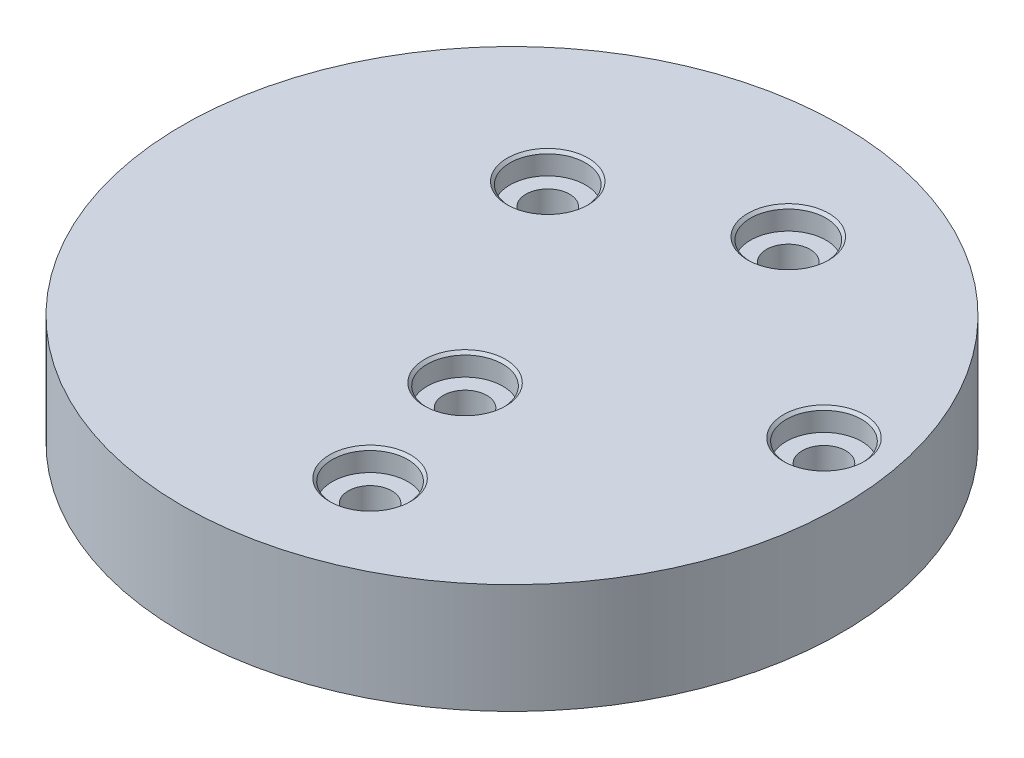
ISO-10303-21;
HEADER;
FILE_DESCRIPTION(('STEP AP214'),'2;1');
FILE_NAME('part.step','',(''),(''),'','','');
FILE_SCHEMA(('AUTOMOTIVE_DESIGN { 1 0 10303 214 1 1 1 1 }'));
ENDSEC;
DATA;
#1=APPLICATION_CONTEXT('core data for automotive mechanical design processes');
#2=APPLICATION_PROTOCOL_DEFINITION('international standard','automotive_design',2000,#1);
#3=PRODUCT_CONTEXT('',#1,'mechanical');
#4=PRODUCT('Part','Part','',(#3));
#5=PRODUCT_RELATED_PRODUCT_CATEGORY('part','',(#4));
#6=PRODUCT_DEFINITION_FORMATION('','',#4);
#7=PRODUCT_DEFINITION_CONTEXT('part definition',#1,'design');
#8=PRODUCT_DEFINITION('design','',#6,#7);
#9=PRODUCT_DEFINITION_SHAPE('','',#8);
#10=(LENGTH_UNIT() NAMED_UNIT(*) SI_UNIT(.MILLI.,.METRE.));
#11=(NAMED_UNIT(*) PLANE_ANGLE_UNIT() SI_UNIT($,.RADIAN.));
#12=(NAMED_UNIT(*) SI_UNIT($,.STERADIAN.) SOLID_ANGLE_UNIT());
#13=UNCERTAINTY_MEASURE_WITH_UNIT(LENGTH_MEASURE(1.E-05),#10,'distance_accuracy_value','');
#14=(GEOMETRIC_REPRESENTATION_CONTEXT(3) GLOBAL_UNCERTAINTY_ASSIGNED_CONTEXT((#13)) GLOBAL_UNIT_ASSIGNED_CONTEXT((#10,
#11,#12)) REPRESENTATION_CONTEXT('',''));
#15=CARTESIAN_POINT('',(0.,0.,0.));
#16=DIRECTION('',(0.,0.,1.));
#17=DIRECTION('',(1.,0.,0.));
#18=AXIS2_PLACEMENT_3D('',#15,#16,#17);
#19=CARTESIAN_POINT('',(0.,-25.4,0.));
#20=DIRECTION('',(0.,1.,0.));
#21=DIRECTION('',(0.,0.,1.));
#22=AXIS2_PLACEMENT_3D('',#19,#20,#21);
#23=CYLINDRICAL_SURFACE('',#22,76.2);
#24=CARTESIAN_POINT('',(0.,-25.4,0.));
#25=DIRECTION('',(0.,1.,0.));
#26=DIRECTION('',(0.,0.,1.));
#27=AXIS2_PLACEMENT_3D('',#24,#25,#26);
#28=CIRCLE('',#27,76.2);
#29=CARTESIAN_POINT('',(0.,-25.4,76.2));
#30=VERTEX_POINT('',#29);
#31=EDGE_CURVE('E10',#30,#30,#28,.T.);
#32=ORIENTED_EDGE('',*,*,#31,.T.);
#33=EDGE_LOOP('',(#32));
#34=FACE_BOUND('',#33,.T.);
#35=CARTESIAN_POINT('',(0.,0.,0.));
#36=DIRECTION('',(0.,1.,0.));
#37=DIRECTION('',(0.,0.,1.));
#38=AXIS2_PLACEMENT_3D('',#35,#36,#37);
#39=CIRCLE('',#38,76.2);
#40=CARTESIAN_POINT('',(0.,0.,76.2));
#41=VERTEX_POINT('',#40);
#42=EDGE_CURVE('E34',#41,#41,#39,.T.);
#43=ORIENTED_EDGE('',*,*,#42,.F.);
#44=EDGE_LOOP('',(#43));
#45=FACE_BOUND('',#44,.T.);
#46=ADVANCED_FACE('F31',(#34,#45),#23,.T.);
#47=CARTESIAN_POINT('',(0.,-25.4,0.));
#48=DIRECTION('',(0.,1.,0.));
#49=DIRECTION('',(0.,0.,1.));
#50=AXIS2_PLACEMENT_3D('',#47,#48,#49);
#51=PLANE('',#50);
#52=CARTESIAN_POINT('',(60.5813080296116,-25.4,-11.5528843035122));
#53=DIRECTION('',(0.,1.,0.));
#54=DIRECTION('',(0.,0.,1.));
#55=AXIS2_PLACEMENT_3D('',#52,#53,#54);
#56=CIRCLE('',#55,5.04189999999999);
#57=CARTESIAN_POINT('',(60.5813080296116,-25.4,-6.51098430351221));
#58=VERTEX_POINT('',#57);
#59=EDGE_CURVE('E102',#58,#58,#56,.T.);
#60=ORIENTED_EDGE('',*,*,#59,.T.);
#61=EDGE_LOOP('',(#60));
#62=FACE_BOUND('',#61,.T.);
#63=CARTESIAN_POINT('',(16.1466383832476,-25.4,48.9641113854304));
#64=DIRECTION('',(0.,1.,0.));
#65=DIRECTION('',(0.,0.,1.));
#66=AXIS2_PLACEMENT_3D('',#63,#64,#65);
#67=CIRCLE('',#66,5.04189999999999);
#68=CARTESIAN_POINT('',(16.1466383832476,-25.4,54.0060113854304));
#69=VERTEX_POINT('',#68);
#70=EDGE_CURVE('E87',#69,#69,#67,.T.);
#71=ORIENTED_EDGE('',*,*,#70,.T.);
#72=EDGE_LOOP('',(#71));
#73=FACE_BOUND('',#72,.T.);
#74=CARTESIAN_POINT('',(8.01491971634505,-25.4,18.8718726723209));
#75=DIRECTION('',(0.,1.,0.));
#76=DIRECTION('',(0.,0.,1.));
#77=AXIS2_PLACEMENT_3D('',#74,#75,#76);
#78=CIRCLE('',#77,5.04189999999999);
#79=CARTESIAN_POINT('',(8.01491971634505,-25.4,23.9137726723209));
#80=VERTEX_POINT('',#79);
#81=EDGE_CURVE('E72',#80,#80,#78,.T.);
#82=ORIENTED_EDGE('',*,*,#81,.T.);
#83=EDGE_LOOP('',(#82));
#84=FACE_BOUND('',#83,.T.);
#85=CARTESIAN_POINT('',(-22.7228826413466,-25.4,-30.9884893052299));
#86=DIRECTION('',(0.,1.,0.));
#87=DIRECTION('',(0.,0.,1.));
#88=AXIS2_PLACEMENT_3D('',#85,#86,#87);
#89=CIRCLE('',#88,5.04189999999999);
#90=CARTESIAN_POINT('',(-22.7228826413466,-25.4,-25.9465893052299));
#91=VERTEX_POINT('',#90);
#92=EDGE_CURVE('E57',#91,#91,#89,.T.);
#93=ORIENTED_EDGE('',*,*,#92,.T.);
#94=EDGE_LOOP('',(#93));
#95=FACE_BOUND('',#94,.T.);
#96=CARTESIAN_POINT('',(16.1466383832476,-25.4,-47.7341404091476));
#97=DIRECTION('',(0.,1.,0.));
#98=DIRECTION('',(0.,0.,1.));
#99=AXIS2_PLACEMENT_3D('',#96,#97,#98);
#100=CIRCLE('',#99,5.04189999999999);
#101=CARTESIAN_POINT('',(16.1466383832476,-25.4,-42.6922404091476));
#102=VERTEX_POINT('',#101);
#103=EDGE_CURVE('E41',#102,#102,#100,.T.);
#104=ORIENTED_EDGE('',*,*,#103,.T.);
#105=EDGE_LOOP('',(#104));
#106=FACE_BOUND('',#105,.T.);
#107=ORIENTED_EDGE('',*,*,#31,.F.);
#108=EDGE_LOOP('',(#107));
#109=FACE_BOUND('',#108,.T.);
#110=ADVANCED_FACE('F124',(#62,#73,#84,#95,#106,#109),#51,.F.);
#111=CARTESIAN_POINT('',(0.,0.,0.));
#112=DIRECTION('',(0.,1.,0.));
#113=DIRECTION('',(0.,0.,1.));
#114=AXIS2_PLACEMENT_3D('',#111,#112,#113);
#115=PLANE('',#114);
#116=CARTESIAN_POINT('',(60.5813080296116,0.,-11.5528843035122));
#117=DIRECTION('',(0.,1.,0.));
#118=DIRECTION('',(0.,0.,1.));
#119=AXIS2_PLACEMENT_3D('',#116,#117,#118);
#120=CIRCLE('',#119,9.36624999999999);
#121=CARTESIAN_POINT('',(60.5813080296116,0.,-2.18663430351221));
#122=VERTEX_POINT('',#121);
#123=EDGE_CURVE('E114',#122,#122,#120,.T.);
#124=ORIENTED_EDGE('',*,*,#123,.F.);
#125=EDGE_LOOP('',(#124));
#126=FACE_BOUND('',#125,.T.);
#127=CARTESIAN_POINT('',(16.1466383832476,0.,48.9641113854304));
#128=DIRECTION('',(0.,1.,0.));
#129=DIRECTION('',(0.,0.,1.));
#130=AXIS2_PLACEMENT_3D('',#127,#128,#129);
#131=CIRCLE('',#130,9.36625);
#132=CARTESIAN_POINT('',(16.1466383832476,0.,58.3303613854304));
#133=VERTEX_POINT('',#132);
#134=EDGE_CURVE('E99',#133,#133,#131,.T.);
#135=ORIENTED_EDGE('',*,*,#134,.F.);
#136=EDGE_LOOP('',(#135));
#137=FACE_BOUND('',#136,.T.);
#138=CARTESIAN_POINT('',(8.01491971634505,0.,18.8718726723209));
#139=DIRECTION('',(0.,1.,0.));
#140=DIRECTION('',(0.,0.,1.));
#141=AXIS2_PLACEMENT_3D('',#138,#139,#140);
#142=CIRCLE('',#141,9.36625);
#143=CARTESIAN_POINT('',(8.01491971634505,0.,28.2381226723209));
#144=VERTEX_POINT('',#143);
#145=EDGE_CURVE('E84',#144,#144,#142,.T.);
#146=ORIENTED_EDGE('',*,*,#145,.F.);
#147=EDGE_LOOP('',(#146));
#148=FACE_BOUND('',#147,.T.);
#149=CARTESIAN_POINT('',(-22.7228826413466,0.,-30.9884893052299));
#150=DIRECTION('',(0.,1.,0.));
#151=DIRECTION('',(0.,0.,1.));
#152=AXIS2_PLACEMENT_3D('',#149,#150,#151);
#153=CIRCLE('',#152,9.36625);
#154=CARTESIAN_POINT('',(-22.7228826413466,0.,-21.6222393052299));
#155=VERTEX_POINT('',#154);
#156=EDGE_CURVE('E69',#155,#155,#153,.T.);
#157=ORIENTED_EDGE('',*,*,#156,.F.);
#158=EDGE_LOOP('',(#157));
#159=FACE_BOUND('',#158,.T.);
#160=CARTESIAN_POINT('',(16.1466383832476,0.,-47.7341404091476));
#161=DIRECTION('',(0.,1.,0.));
#162=DIRECTION('',(0.,0.,1.));
#163=AXIS2_PLACEMENT_3D('',#160,#161,#162);
#164=CIRCLE('',#163,9.36625);
#165=CARTESIAN_POINT('',(16.1466383832476,0.,-38.3678904091476));
#166=VERTEX_POINT('',#165);
#167=EDGE_CURVE('E54',#166,#166,#164,.T.);
#168=ORIENTED_EDGE('',*,*,#167,.F.);
#169=EDGE_LOOP('',(#168));
#170=FACE_BOUND('',#169,.T.);
#171=ORIENTED_EDGE('',*,*,#42,.T.);
#172=EDGE_LOOP('',(#171));
#173=FACE_BOUND('',#172,.T.);
#174=ADVANCED_FACE('F120',(#126,#137,#148,#159,#170,#173),#115,.T.);
#175=CARTESIAN_POINT('',(16.1466383832476,0.,-47.7341404091476));
#176=DIRECTION('',(0.,1.,0.));
#177=DIRECTION('',(0.,0.,1.));
#178=AXIS2_PLACEMENT_3D('',#175,#176,#177);
#179=CYLINDRICAL_SURFACE('',#178,5.0419);
#180=ORIENTED_EDGE('',*,*,#103,.F.);
#181=EDGE_LOOP('',(#180));
#182=FACE_BOUND('',#181,.T.);
#183=CARTESIAN_POINT('',(16.1466383832476,-5.0546,-47.7341404091476));
#184=DIRECTION('',(0.,1.,0.));
#185=DIRECTION('',(0.,0.,1.));
#186=AXIS2_PLACEMENT_3D('',#183,#184,#185);
#187=CIRCLE('',#186,5.0419);
#188=CARTESIAN_POINT('',(16.1466383832476,-5.0546,-42.6922404091476));
#189=VERTEX_POINT('',#188);
#190=EDGE_CURVE('E45',#189,#189,#187,.T.);
#191=ORIENTED_EDGE('',*,*,#190,.T.);
#192=EDGE_LOOP('',(#191));
#193=FACE_BOUND('',#192,.T.);
#194=ADVANCED_FACE('F123',(#182,#193),#179,.F.);
#195=CARTESIAN_POINT('',(24.8778883832476,-5.0546,-47.7341404091476));
#196=DIRECTION('',(0.,-1.,0.));
#197=DIRECTION('',(0.,0.,-1.));
#198=AXIS2_PLACEMENT_3D('',#195,#196,#197);
#199=PLANE('',#198);
#200=ORIENTED_EDGE('',*,*,#190,.F.);
#201=EDGE_LOOP('',(#200));
#202=FACE_BOUND('',#201,.T.);
#203=CARTESIAN_POINT('',(16.1466383832476,-5.0546,-47.7341404091476));
#204=DIRECTION('',(0.,1.,0.));
#205=DIRECTION('',(0.,0.,1.));
#206=AXIS2_PLACEMENT_3D('',#203,#204,#205);
#207=CIRCLE('',#206,8.73125);
#208=CARTESIAN_POINT('',(16.1466383832476,-5.0546,-39.0028904091476));
#209=VERTEX_POINT('',#208);
#210=EDGE_CURVE('E48',#209,#209,#207,.T.);
#211=ORIENTED_EDGE('',*,*,#210,.T.);
#212=EDGE_LOOP('',(#211));
#213=FACE_BOUND('',#212,.T.);
#214=ADVANCED_FACE('F147',(#202,#213),#199,.F.);
#215=CARTESIAN_POINT('',(16.1466383832476,0.,-47.7341404091476));
#216=DIRECTION('',(0.,1.,0.));
#217=DIRECTION('',(0.,0.,1.));
#218=AXIS2_PLACEMENT_3D('',#215,#216,#217);
#219=CYLINDRICAL_SURFACE('',#218,8.73125);
#220=ORIENTED_EDGE('',*,*,#210,.F.);
#221=EDGE_LOOP('',(#220));
#222=FACE_BOUND('',#221,.T.);
#223=CARTESIAN_POINT('',(16.1466383832476,-0.635,-47.7341404091476));
#224=DIRECTION('',(0.,1.,0.));
#225=DIRECTION('',(0.,0.,1.));
#226=AXIS2_PLACEMENT_3D('',#223,#224,#225);
#227=CIRCLE('',#226,8.73125);
#228=CARTESIAN_POINT('',(16.1466383832476,-0.635,-39.0028904091476));
#229=VERTEX_POINT('',#228);
#230=EDGE_CURVE('E51',#229,#229,#227,.T.);
#231=ORIENTED_EDGE('',*,*,#230,.T.);
#232=EDGE_LOOP('',(#231));
#233=FACE_BOUND('',#232,.T.);
#234=ADVANCED_FACE('F151',(#222,#233),#219,.F.);
#235=CARTESIAN_POINT('',(16.1466383832476,0.,-47.7341404091476));
#236=DIRECTION('',(0.,1.,0.));
#237=DIRECTION('',(0.,0.,1.));
#238=AXIS2_PLACEMENT_3D('',#235,#236,#237);
#239=CONICAL_SURFACE('',#238,9.36625,0.785398163397451);
#240=ORIENTED_EDGE('',*,*,#230,.F.);
#241=EDGE_LOOP('',(#240));
#242=FACE_BOUND('',#241,.T.);
#243=ORIENTED_EDGE('',*,*,#167,.T.);
#244=EDGE_LOOP('',(#243));
#245=FACE_BOUND('',#244,.T.);
#246=ADVANCED_FACE('F155',(#242,#245),#239,.F.);
#247=CARTESIAN_POINT('',(-22.7228826413466,0.,-30.9884893052299));
#248=DIRECTION('',(0.,1.,0.));
#249=DIRECTION('',(0.,0.,1.));
#250=AXIS2_PLACEMENT_3D('',#247,#248,#249);
#251=CYLINDRICAL_SURFACE('',#250,5.0419);
#252=ORIENTED_EDGE('',*,*,#92,.F.);
#253=EDGE_LOOP('',(#252));
#254=FACE_BOUND('',#253,.T.);
#255=CARTESIAN_POINT('',(-22.7228826413466,-5.0546,-30.9884893052299));
#256=DIRECTION('',(0.,1.,0.));
#257=DIRECTION('',(0.,0.,1.));
#258=AXIS2_PLACEMENT_3D('',#255,#256,#257);
#259=CIRCLE('',#258,5.0419);
#260=CARTESIAN_POINT('',(-22.7228826413466,-5.0546,-25.9465893052299));
#261=VERTEX_POINT('',#260);
#262=EDGE_CURVE('E60',#261,#261,#259,.T.);
#263=ORIENTED_EDGE('',*,*,#262,.T.);
#264=EDGE_LOOP('',(#263));
#265=FACE_BOUND('',#264,.T.);
#266=ADVANCED_FACE('F159',(#254,#265),#251,.F.);
#267=CARTESIAN_POINT('',(-13.9916326413466,-5.0546,-30.9884893052299));
#268=DIRECTION('',(0.,-1.,0.));
#269=DIRECTION('',(0.,0.,-1.));
#270=AXIS2_PLACEMENT_3D('',#267,#268,#269);
#271=PLANE('',#270);
#272=ORIENTED_EDGE('',*,*,#262,.F.);
#273=EDGE_LOOP('',(#272));
#274=FACE_BOUND('',#273,.T.);
#275=CARTESIAN_POINT('',(-22.7228826413466,-5.0546,-30.9884893052299));
#276=DIRECTION('',(0.,1.,0.));
#277=DIRECTION('',(0.,0.,1.));
#278=AXIS2_PLACEMENT_3D('',#275,#276,#277);
#279=CIRCLE('',#278,8.73125);
#280=CARTESIAN_POINT('',(-22.7228826413466,-5.0546,-22.2572393052299));
#281=VERTEX_POINT('',#280);
#282=EDGE_CURVE('E63',#281,#281,#279,.T.);
#283=ORIENTED_EDGE('',*,*,#282,.T.);
#284=EDGE_LOOP('',(#283));
#285=FACE_BOUND('',#284,.T.);
#286=ADVANCED_FACE('F163',(#274,#285),#271,.F.);
#287=CARTESIAN_POINT('',(-22.7228826413466,0.,-30.9884893052299));
#288=DIRECTION('',(0.,1.,0.));
#289=DIRECTION('',(0.,0.,1.));
#290=AXIS2_PLACEMENT_3D('',#287,#288,#289);
#291=CYLINDRICAL_SURFACE('',#290,8.73125);
#292=ORIENTED_EDGE('',*,*,#282,.F.);
#293=EDGE_LOOP('',(#292));
#294=FACE_BOUND('',#293,.T.);
#295=CARTESIAN_POINT('',(-22.7228826413466,-0.635,-30.9884893052299));
#296=DIRECTION('',(0.,1.,0.));
#297=DIRECTION('',(0.,0.,1.));
#298=AXIS2_PLACEMENT_3D('',#295,#296,#297);
#299=CIRCLE('',#298,8.73125);
#300=CARTESIAN_POINT('',(-22.7228826413466,-0.635,-22.2572393052299));
#301=VERTEX_POINT('',#300);
#302=EDGE_CURVE('E66',#301,#301,#299,.T.);
#303=ORIENTED_EDGE('',*,*,#302,.T.);
#304=EDGE_LOOP('',(#303));
#305=FACE_BOUND('',#304,.T.);
#306=ADVANCED_FACE('F167',(#294,#305),#291,.F.);
#307=CARTESIAN_POINT('',(-22.7228826413466,0.,-30.9884893052299));
#308=DIRECTION('',(0.,1.,0.));
#309=DIRECTION('',(0.,0.,1.));
#310=AXIS2_PLACEMENT_3D('',#307,#308,#309);
#311=CONICAL_SURFACE('',#310,9.36625,0.78539816339745);
#312=ORIENTED_EDGE('',*,*,#302,.F.);
#313=EDGE_LOOP('',(#312));
#314=FACE_BOUND('',#313,.T.);
#315=ORIENTED_EDGE('',*,*,#156,.T.);
#316=EDGE_LOOP('',(#315));
#317=FACE_BOUND('',#316,.T.);
#318=ADVANCED_FACE('F171',(#314,#317),#311,.F.);
#319=CARTESIAN_POINT('',(8.01491971634505,0.,18.8718726723209));
#320=DIRECTION('',(0.,1.,0.));
#321=DIRECTION('',(0.,0.,1.));
#322=AXIS2_PLACEMENT_3D('',#319,#320,#321);
#323=CYLINDRICAL_SURFACE('',#322,5.0419);
#324=ORIENTED_EDGE('',*,*,#81,.F.);
#325=EDGE_LOOP('',(#324));
#326=FACE_BOUND('',#325,.T.);
#327=CARTESIAN_POINT('',(8.01491971634505,-5.0546,18.8718726723209));
#328=DIRECTION('',(0.,1.,0.));
#329=DIRECTION('',(0.,0.,1.));
#330=AXIS2_PLACEMENT_3D('',#327,#328,#329);
#331=CIRCLE('',#330,5.0419);
#332=CARTESIAN_POINT('',(8.01491971634505,-5.0546,23.9137726723209));
#333=VERTEX_POINT('',#332);
#334=EDGE_CURVE('E75',#333,#333,#331,.T.);
#335=ORIENTED_EDGE('',*,*,#334,.T.);
#336=EDGE_LOOP('',(#335));
#337=FACE_BOUND('',#336,.T.);
#338=ADVANCED_FACE('F175',(#326,#337),#323,.F.);
#339=CARTESIAN_POINT('',(16.746169716345,-5.0546,18.8718726723209));
#340=DIRECTION('',(0.,-1.,0.));
#341=DIRECTION('',(0.,0.,-1.));
#342=AXIS2_PLACEMENT_3D('',#339,#340,#341);
#343=PLANE('',#342);
#344=ORIENTED_EDGE('',*,*,#334,.F.);
#345=EDGE_LOOP('',(#344));
#346=FACE_BOUND('',#345,.T.);
#347=CARTESIAN_POINT('',(8.01491971634505,-5.0546,18.8718726723209));
#348=DIRECTION('',(0.,1.,0.));
#349=DIRECTION('',(0.,0.,1.));
#350=AXIS2_PLACEMENT_3D('',#347,#348,#349);
#351=CIRCLE('',#350,8.73125);
#352=CARTESIAN_POINT('',(8.01491971634505,-5.0546,27.6031226723209));
#353=VERTEX_POINT('',#352);
#354=EDGE_CURVE('E78',#353,#353,#351,.T.);
#355=ORIENTED_EDGE('',*,*,#354,.T.);
#356=EDGE_LOOP('',(#355));
#357=FACE_BOUND('',#356,.T.);
#358=ADVANCED_FACE('F179',(#346,#357),#343,.F.);
#359=CARTESIAN_POINT('',(8.01491971634505,0.,18.8718726723209));
#360=DIRECTION('',(0.,1.,0.));
#361=DIRECTION('',(0.,0.,1.));
#362=AXIS2_PLACEMENT_3D('',#359,#360,#361);
#363=CYLINDRICAL_SURFACE('',#362,8.73125);
#364=ORIENTED_EDGE('',*,*,#354,.F.);
#365=EDGE_LOOP('',(#364));
#366=FACE_BOUND('',#365,.T.);
#367=CARTESIAN_POINT('',(8.01491971634505,-0.635,18.8718726723209));
#368=DIRECTION('',(0.,1.,0.));
#369=DIRECTION('',(0.,0.,1.));
#370=AXIS2_PLACEMENT_3D('',#367,#368,#369);
#371=CIRCLE('',#370,8.73125);
#372=CARTESIAN_POINT('',(8.01491971634505,-0.635,27.6031226723209));
#373=VERTEX_POINT('',#372);
#374=EDGE_CURVE('E81',#373,#373,#371,.T.);
#375=ORIENTED_EDGE('',*,*,#374,.T.);
#376=EDGE_LOOP('',(#375));
#377=FACE_BOUND('',#376,.T.);
#378=ADVANCED_FACE('F183',(#366,#377),#363,.F.);
#379=CARTESIAN_POINT('',(8.01491971634505,0.,18.8718726723209));
#380=DIRECTION('',(0.,1.,0.));
#381=DIRECTION('',(0.,0.,1.));
#382=AXIS2_PLACEMENT_3D('',#379,#380,#381);
#383=CONICAL_SURFACE('',#382,9.36625,0.785398163397451);
#384=ORIENTED_EDGE('',*,*,#374,.F.);
#385=EDGE_LOOP('',(#384));
#386=FACE_BOUND('',#385,.T.);
#387=ORIENTED_EDGE('',*,*,#145,.T.);
#388=EDGE_LOOP('',(#387));
#389=FACE_BOUND('',#388,.T.);
#390=ADVANCED_FACE('F187',(#386,#389),#383,.F.);
#391=CARTESIAN_POINT('',(16.1466383832476,0.,48.9641113854304));
#392=DIRECTION('',(0.,1.,0.));
#393=DIRECTION('',(0.,0.,1.));
#394=AXIS2_PLACEMENT_3D('',#391,#392,#393);
#395=CYLINDRICAL_SURFACE('',#394,5.0419);
#396=ORIENTED_EDGE('',*,*,#70,.F.);
#397=EDGE_LOOP('',(#396));
#398=FACE_BOUND('',#397,.T.);
#399=CARTESIAN_POINT('',(16.1466383832476,-5.0546,48.9641113854304));
#400=DIRECTION('',(0.,1.,0.));
#401=DIRECTION('',(0.,0.,1.));
#402=AXIS2_PLACEMENT_3D('',#399,#400,#401);
#403=CIRCLE('',#402,5.0419);
#404=CARTESIAN_POINT('',(16.1466383832476,-5.0546,54.0060113854304));
#405=VERTEX_POINT('',#404);
#406=EDGE_CURVE('E90',#405,#405,#403,.T.);
#407=ORIENTED_EDGE('',*,*,#406,.T.);
#408=EDGE_LOOP('',(#407));
#409=FACE_BOUND('',#408,.T.);
#410=ADVANCED_FACE('F191',(#398,#409),#395,.F.);
#411=CARTESIAN_POINT('',(24.8778883832476,-5.0546,48.9641113854304));
#412=DIRECTION('',(0.,-1.,0.));
#413=DIRECTION('',(0.,0.,-1.));
#414=AXIS2_PLACEMENT_3D('',#411,#412,#413);
#415=PLANE('',#414);
#416=ORIENTED_EDGE('',*,*,#406,.F.);
#417=EDGE_LOOP('',(#416));
#418=FACE_BOUND('',#417,.T.);
#419=CARTESIAN_POINT('',(16.1466383832476,-5.0546,48.9641113854304));
#420=DIRECTION('',(0.,1.,0.));
#421=DIRECTION('',(0.,0.,1.));
#422=AXIS2_PLACEMENT_3D('',#419,#420,#421);
#423=CIRCLE('',#422,8.73125);
#424=CARTESIAN_POINT('',(16.1466383832476,-5.0546,57.6953613854304));
#425=VERTEX_POINT('',#424);
#426=EDGE_CURVE('E93',#425,#425,#423,.T.);
#427=ORIENTED_EDGE('',*,*,#426,.T.);
#428=EDGE_LOOP('',(#427));
#429=FACE_BOUND('',#428,.T.);
#430=ADVANCED_FACE('F195',(#418,#429),#415,.F.);
#431=CARTESIAN_POINT('',(16.1466383832476,0.,48.9641113854304));
#432=DIRECTION('',(0.,1.,0.));
#433=DIRECTION('',(0.,0.,1.));
#434=AXIS2_PLACEMENT_3D('',#431,#432,#433);
#435=CYLINDRICAL_SURFACE('',#434,8.73125);
#436=ORIENTED_EDGE('',*,*,#426,.F.);
#437=EDGE_LOOP('',(#436));
#438=FACE_BOUND('',#437,.T.);
#439=CARTESIAN_POINT('',(16.1466383832476,-0.635,48.9641113854304));
#440=DIRECTION('',(0.,1.,0.));
#441=DIRECTION('',(0.,0.,1.));
#442=AXIS2_PLACEMENT_3D('',#439,#440,#441);
#443=CIRCLE('',#442,8.73125);
#444=CARTESIAN_POINT('',(16.1466383832476,-0.635,57.6953613854304));
#445=VERTEX_POINT('',#444);
#446=EDGE_CURVE('E96',#445,#445,#443,.T.);
#447=ORIENTED_EDGE('',*,*,#446,.T.);
#448=EDGE_LOOP('',(#447));
#449=FACE_BOUND('',#448,.T.);
#450=ADVANCED_FACE('F199',(#438,#449),#435,.F.);
#451=CARTESIAN_POINT('',(16.1466383832476,0.,48.9641113854304));
#452=DIRECTION('',(0.,1.,0.));
#453=DIRECTION('',(0.,0.,1.));
#454=AXIS2_PLACEMENT_3D('',#451,#452,#453);
#455=CONICAL_SURFACE('',#454,9.36625,0.785398163397451);
#456=ORIENTED_EDGE('',*,*,#446,.F.);
#457=EDGE_LOOP('',(#456));
#458=FACE_BOUND('',#457,.T.);
#459=ORIENTED_EDGE('',*,*,#134,.T.);
#460=EDGE_LOOP('',(#459));
#461=FACE_BOUND('',#460,.T.);
#462=ADVANCED_FACE('F203',(#458,#461),#455,.F.);
#463=CARTESIAN_POINT('',(60.5813080296116,0.,-11.5528843035122));
#464=DIRECTION('',(0.,1.,0.));
#465=DIRECTION('',(0.,0.,1.));
#466=AXIS2_PLACEMENT_3D('',#463,#464,#465);
#467=CYLINDRICAL_SURFACE('',#466,5.04189999999999);
#468=ORIENTED_EDGE('',*,*,#59,.F.);
#469=EDGE_LOOP('',(#468));
#470=FACE_BOUND('',#469,.T.);
#471=CARTESIAN_POINT('',(60.5813080296116,-5.0546,-11.5528843035122));
#472=DIRECTION('',(0.,1.,0.));
#473=DIRECTION('',(0.,0.,1.));
#474=AXIS2_PLACEMENT_3D('',#471,#472,#473);
#475=CIRCLE('',#474,5.0419);
#476=CARTESIAN_POINT('',(60.5813080296116,-5.0546,-6.5109843035122));
#477=VERTEX_POINT('',#476);
#478=EDGE_CURVE('E105',#477,#477,#475,.T.);
#479=ORIENTED_EDGE('',*,*,#478,.T.);
#480=EDGE_LOOP('',(#479));
#481=FACE_BOUND('',#480,.T.);
#482=ADVANCED_FACE('F207',(#470,#481),#467,.F.);
#483=CARTESIAN_POINT('',(69.3125580296116,-5.0546,-11.5528843035122));
#484=DIRECTION('',(0.,-1.,0.));
#485=DIRECTION('',(0.,0.,-1.));
#486=AXIS2_PLACEMENT_3D('',#483,#484,#485);
#487=PLANE('',#486);
#488=ORIENTED_EDGE('',*,*,#478,.F.);
#489=EDGE_LOOP('',(#488));
#490=FACE_BOUND('',#489,.T.);
#491=CARTESIAN_POINT('',(60.5813080296116,-5.0546,-11.5528843035122));
#492=DIRECTION('',(0.,1.,0.));
#493=DIRECTION('',(0.,0.,1.));
#494=AXIS2_PLACEMENT_3D('',#491,#492,#493);
#495=CIRCLE('',#494,8.73125);
#496=CARTESIAN_POINT('',(60.5813080296116,-5.0546,-2.82163430351221));
#497=VERTEX_POINT('',#496);
#498=EDGE_CURVE('E108',#497,#497,#495,.T.);
#499=ORIENTED_EDGE('',*,*,#498,.T.);
#500=EDGE_LOOP('',(#499));
#501=FACE_BOUND('',#500,.T.);
#502=ADVANCED_FACE('F211',(#490,#501),#487,.F.);
#503=CARTESIAN_POINT('',(60.5813080296116,0.,-11.5528843035122));
#504=DIRECTION('',(0.,1.,0.));
#505=DIRECTION('',(0.,0.,1.));
#506=AXIS2_PLACEMENT_3D('',#503,#504,#505);
#507=CYLINDRICAL_SURFACE('',#506,8.73125);
#508=ORIENTED_EDGE('',*,*,#498,.F.);
#509=EDGE_LOOP('',(#508));
#510=FACE_BOUND('',#509,.T.);
#511=CARTESIAN_POINT('',(60.5813080296116,-0.635,-11.5528843035122));
#512=DIRECTION('',(0.,1.,0.));
#513=DIRECTION('',(0.,0.,1.));
#514=AXIS2_PLACEMENT_3D('',#511,#512,#513);
#515=CIRCLE('',#514,8.73125);
#516=CARTESIAN_POINT('',(60.5813080296116,-0.635,-2.82163430351221));
#517=VERTEX_POINT('',#516);
#518=EDGE_CURVE('E111',#517,#517,#515,.T.);
#519=ORIENTED_EDGE('',*,*,#518,.T.);
#520=EDGE_LOOP('',(#519));
#521=FACE_BOUND('',#520,.T.);
#522=ADVANCED_FACE('F215',(#510,#521),#507,.F.);
#523=CARTESIAN_POINT('',(60.5813080296116,0.,-11.5528843035122));
#524=DIRECTION('',(0.,1.,0.));
#525=DIRECTION('',(0.,0.,1.));
#526=AXIS2_PLACEMENT_3D('',#523,#524,#525);
#527=CONICAL_SURFACE('',#526,9.36624999999999,0.785398163397446);
#528=ORIENTED_EDGE('',*,*,#518,.F.);
#529=EDGE_LOOP('',(#528));
#530=FACE_BOUND('',#529,.T.);
#531=ORIENTED_EDGE('',*,*,#123,.T.);
#532=EDGE_LOOP('',(#531));
#533=FACE_BOUND('',#532,.T.);
#534=ADVANCED_FACE('F118',(#530,#533),#527,.F.);
#535=CLOSED_SHELL('',(#46,#110,#174,#194,#214,#234,#246,#266,#286,#306,#318,#338,#358,#378,#390,
#410,#430,#450,#462,#482,#502,#522,#534));
#536=MANIFOLD_SOLID_BREP('B2',#535);
#537=ADVANCED_BREP_SHAPE_REPRESENTATION('',(#18,#536),#14);
#538=SHAPE_DEFINITION_REPRESENTATION(#9,#537);
ENDSEC;
END-ISO-10303-21;
